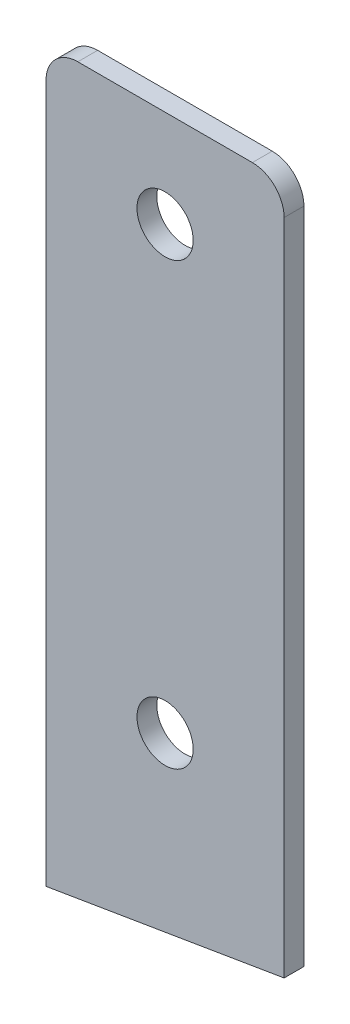
ISO-10303-21;
HEADER;
FILE_DESCRIPTION(('STEP AP214'),'2;1');
FILE_NAME('part.step','',(''),(''),'','','');
FILE_SCHEMA(('AUTOMOTIVE_DESIGN { 1 0 10303 214 1 1 1 1 }'));
ENDSEC;
DATA;
#1=APPLICATION_CONTEXT('core data for automotive mechanical design processes');
#2=APPLICATION_PROTOCOL_DEFINITION('international standard','automotive_design',2000,#1);
#3=PRODUCT_CONTEXT('',#1,'mechanical');
#4=PRODUCT('Part','Part','',(#3));
#5=PRODUCT_RELATED_PRODUCT_CATEGORY('part','',(#4));
#6=PRODUCT_DEFINITION_FORMATION('','',#4);
#7=PRODUCT_DEFINITION_CONTEXT('part definition',#1,'design');
#8=PRODUCT_DEFINITION('design','',#6,#7);
#9=PRODUCT_DEFINITION_SHAPE('','',#8);
#10=(LENGTH_UNIT() NAMED_UNIT(*) SI_UNIT(.MILLI.,.METRE.));
#11=(NAMED_UNIT(*) PLANE_ANGLE_UNIT() SI_UNIT($,.RADIAN.));
#12=(NAMED_UNIT(*) SI_UNIT($,.STERADIAN.) SOLID_ANGLE_UNIT());
#13=UNCERTAINTY_MEASURE_WITH_UNIT(LENGTH_MEASURE(1.E-05),#10,'distance_accuracy_value','');
#14=(GEOMETRIC_REPRESENTATION_CONTEXT(3) GLOBAL_UNCERTAINTY_ASSIGNED_CONTEXT((#13)) GLOBAL_UNIT_ASSIGNED_CONTEXT((#10,
#11,#12)) REPRESENTATION_CONTEXT('',''));
#15=CARTESIAN_POINT('',(0.,0.,0.));
#16=DIRECTION('',(0.,0.,1.));
#17=DIRECTION('',(1.,0.,0.));
#18=AXIS2_PLACEMENT_3D('',#15,#16,#17);
#19=CARTESIAN_POINT('',(9.525,0.,1.5875));
#20=DIRECTION('',(1.,0.,0.));
#21=DIRECTION('',(0.,1.,0.));
#22=AXIS2_PLACEMENT_3D('',#19,#20,#21);
#23=PLANE('',#22);
#24=DIRECTION('',(0.,-1.,0.));
#25=VECTOR('',#24,1.);
#26=CARTESIAN_POINT('',(9.525,0.,1.5875));
#27=LINE('',#26,#25);
#28=CARTESIAN_POINT('',(9.525,22.86,1.5875));
#29=VERTEX_POINT('',#28);
#30=CARTESIAN_POINT('',(9.52500000000001,-29.845,1.5875));
#31=VERTEX_POINT('',#30);
#32=EDGE_CURVE('E118',#29,#31,#27,.T.);
#33=ORIENTED_EDGE('',*,*,#32,.T.);
#34=DIRECTION('',(0.,0.,1.));
#35=VECTOR('',#34,1.);
#36=CARTESIAN_POINT('',(9.52500000000001,-29.845,0.));
#37=LINE('',#36,#35);
#38=CARTESIAN_POINT('',(9.52500000000001,-29.845,0.));
#39=VERTEX_POINT('',#38);
#40=EDGE_CURVE('E112',#39,#31,#37,.T.);
#41=ORIENTED_EDGE('',*,*,#40,.F.);
#42=DIRECTION('',(0.,-1.,0.));
#43=VECTOR('',#42,1.);
#44=CARTESIAN_POINT('',(9.525,0.,0.));
#45=LINE('',#44,#43);
#46=CARTESIAN_POINT('',(9.525,22.86,0.));
#47=VERTEX_POINT('',#46);
#48=EDGE_CURVE('E111',#47,#39,#45,.T.);
#49=ORIENTED_EDGE('',*,*,#48,.F.);
#50=DIRECTION('',(0.,0.,-1.));
#51=VECTOR('',#50,1.);
#52=CARTESIAN_POINT('',(9.525,22.86,1.5875));
#53=LINE('',#52,#51);
#54=EDGE_CURVE('E12',#47,#29,#53,.F.);
#55=ORIENTED_EDGE('',*,*,#54,.T.);
#56=EDGE_LOOP('',(#33,#41,#49,#55));
#57=FACE_BOUND('',#56,.T.);
#58=ADVANCED_FACE('F39',(#57),#23,.T.);
#59=CARTESIAN_POINT('',(0.,0.,1.5875));
#60=DIRECTION('',(0.,0.,1.));
#61=DIRECTION('',(1.,0.,0.));
#62=AXIS2_PLACEMENT_3D('',#59,#60,#61);
#63=PLANE('',#62);
#64=CARTESIAN_POINT('',(0.,17.6276,1.5875));
#65=DIRECTION('',(0.,0.,1.));
#66=DIRECTION('',(1.,0.,0.));
#67=AXIS2_PLACEMENT_3D('',#64,#65,#66);
#68=CIRCLE('',#67,2.24999999999999);
#69=CARTESIAN_POINT('',(2.24999999999999,17.6276,1.5875));
#70=VERTEX_POINT('',#69);
#71=EDGE_CURVE('E105',#70,#70,#68,.T.);
#72=ORIENTED_EDGE('',*,*,#71,.F.);
#73=EDGE_LOOP('',(#72));
#74=FACE_BOUND('',#73,.T.);
#75=CARTESIAN_POINT('',(0.,-17.6276,1.5875));
#76=DIRECTION('',(0.,0.,1.));
#77=DIRECTION('',(1.,0.,0.));
#78=AXIS2_PLACEMENT_3D('',#75,#76,#77);
#79=CIRCLE('',#78,2.24999999999999);
#80=CARTESIAN_POINT('',(2.24999999999999,-17.6276,1.5875));
#81=VERTEX_POINT('',#80);
#82=EDGE_CURVE('E149',#81,#81,#79,.T.);
#83=ORIENTED_EDGE('',*,*,#82,.F.);
#84=EDGE_LOOP('',(#83));
#85=FACE_BOUND('',#84,.T.);
#86=DIRECTION('',(0.,-1.,0.));
#87=VECTOR('',#86,1.);
#88=CARTESIAN_POINT('',(-9.525,0.,1.5875));
#89=LINE('',#88,#87);
#90=CARTESIAN_POINT('',(-9.525,22.86,1.5875));
#91=VERTEX_POINT('',#90);
#92=CARTESIAN_POINT('',(-9.525,-33.02,1.5875));
#93=VERTEX_POINT('',#92);
#94=EDGE_CURVE('E129',#91,#93,#89,.T.);
#95=ORIENTED_EDGE('',*,*,#94,.T.);
#96=DIRECTION('',(0.986393923832144,0.164398987305357,0.));
#97=VECTOR('',#96,1.);
#98=CARTESIAN_POINT('',(5.09716216216216,-30.582972972973,1.5875));
#99=LINE('',#98,#97);
#100=EDGE_CURVE('E100',#93,#31,#99,.T.);
#101=ORIENTED_EDGE('',*,*,#100,.T.);
#102=ORIENTED_EDGE('',*,*,#32,.F.);
#103=CARTESIAN_POINT('',(6.985,22.86,1.5875));
#104=DIRECTION('',(0.,0.,1.));
#105=DIRECTION('',(1.,0.,0.));
#106=AXIS2_PLACEMENT_3D('',#103,#104,#105);
#107=CIRCLE('',#106,2.54);
#108=CARTESIAN_POINT('',(6.985,25.4,1.5875));
#109=VERTEX_POINT('',#108);
#110=EDGE_CURVE('E61',#29,#109,#107,.T.);
#111=ORIENTED_EDGE('',*,*,#110,.T.);
#112=DIRECTION('',(1.,0.,0.));
#113=VECTOR('',#112,1.);
#114=CARTESIAN_POINT('',(0.,25.4,1.5875));
#115=LINE('',#114,#113);
#116=CARTESIAN_POINT('',(-6.985,25.4,1.5875));
#117=VERTEX_POINT('',#116);
#118=EDGE_CURVE('E121',#117,#109,#115,.T.);
#119=ORIENTED_EDGE('',*,*,#118,.F.);
#120=CARTESIAN_POINT('',(-6.985,22.86,1.5875));
#121=DIRECTION('',(0.,0.,1.));
#122=DIRECTION('',(1.,0.,0.));
#123=AXIS2_PLACEMENT_3D('',#120,#121,#122);
#124=CIRCLE('',#123,2.54);
#125=EDGE_CURVE('E48',#117,#91,#124,.T.);
#126=ORIENTED_EDGE('',*,*,#125,.T.);
#127=EDGE_LOOP('',(#95,#101,#102,#111,#119,#126));
#128=FACE_BOUND('',#127,.T.);
#129=ADVANCED_FACE('F166',(#74,#85,#128),#63,.T.);
#130=CARTESIAN_POINT('',(0.,0.,0.));
#131=DIRECTION('',(0.,0.,1.));
#132=DIRECTION('',(1.,0.,0.));
#133=AXIS2_PLACEMENT_3D('',#130,#131,#132);
#134=PLANE('',#133);
#135=CARTESIAN_POINT('',(0.,-17.6276,0.));
#136=DIRECTION('',(0.,0.,1.));
#137=DIRECTION('',(1.,0.,0.));
#138=AXIS2_PLACEMENT_3D('',#135,#136,#137);
#139=CIRCLE('',#138,2.25);
#140=CARTESIAN_POINT('',(2.25,-17.6276,0.));
#141=VERTEX_POINT('',#140);
#142=EDGE_CURVE('E147',#141,#141,#139,.T.);
#143=ORIENTED_EDGE('',*,*,#142,.T.);
#144=EDGE_LOOP('',(#143));
#145=FACE_BOUND('',#144,.T.);
#146=CARTESIAN_POINT('',(0.,17.6276,0.));
#147=DIRECTION('',(0.,0.,1.));
#148=DIRECTION('',(1.,0.,0.));
#149=AXIS2_PLACEMENT_3D('',#146,#147,#148);
#150=CIRCLE('',#149,2.25);
#151=CARTESIAN_POINT('',(2.25,17.6276,0.));
#152=VERTEX_POINT('',#151);
#153=EDGE_CURVE('E153',#152,#152,#150,.T.);
#154=ORIENTED_EDGE('',*,*,#153,.T.);
#155=EDGE_LOOP('',(#154));
#156=FACE_BOUND('',#155,.T.);
#157=DIRECTION('',(0.986393923832144,0.164398987305357,0.));
#158=VECTOR('',#157,1.);
#159=CARTESIAN_POINT('',(5.09716216216216,-30.582972972973,0.));
#160=LINE('',#159,#158);
#161=CARTESIAN_POINT('',(-9.525,-33.02,0.));
#162=VERTEX_POINT('',#161);
#163=EDGE_CURVE('E97',#162,#39,#160,.T.);
#164=ORIENTED_EDGE('',*,*,#163,.F.);
#165=DIRECTION('',(0.,-1.,0.));
#166=VECTOR('',#165,1.);
#167=CARTESIAN_POINT('',(-9.525,0.,0.));
#168=LINE('',#167,#166);
#169=CARTESIAN_POINT('',(-9.525,22.86,0.));
#170=VERTEX_POINT('',#169);
#171=EDGE_CURVE('E110',#170,#162,#168,.T.);
#172=ORIENTED_EDGE('',*,*,#171,.F.);
#173=CARTESIAN_POINT('',(-6.985,22.86,0.));
#174=DIRECTION('',(0.,0.,1.));
#175=DIRECTION('',(1.,0.,0.));
#176=AXIS2_PLACEMENT_3D('',#173,#174,#175);
#177=CIRCLE('',#176,2.54);
#178=CARTESIAN_POINT('',(-6.985,25.4,0.));
#179=VERTEX_POINT('',#178);
#180=EDGE_CURVE('E131',#170,#179,#177,.F.);
#181=ORIENTED_EDGE('',*,*,#180,.T.);
#182=DIRECTION('',(1.,0.,0.));
#183=VECTOR('',#182,1.);
#184=CARTESIAN_POINT('',(0.,25.4,0.));
#185=LINE('',#184,#183);
#186=CARTESIAN_POINT('',(6.985,25.4,0.));
#187=VERTEX_POINT('',#186);
#188=EDGE_CURVE('E119',#179,#187,#185,.T.);
#189=ORIENTED_EDGE('',*,*,#188,.T.);
#190=CARTESIAN_POINT('',(6.985,22.86,0.));
#191=DIRECTION('',(0.,0.,1.));
#192=DIRECTION('',(1.,0.,0.));
#193=AXIS2_PLACEMENT_3D('',#190,#191,#192);
#194=CIRCLE('',#193,2.54);
#195=EDGE_CURVE('E128',#187,#47,#194,.F.);
#196=ORIENTED_EDGE('',*,*,#195,.T.);
#197=ORIENTED_EDGE('',*,*,#48,.T.);
#198=EDGE_LOOP('',(#164,#172,#181,#189,#196,#197));
#199=FACE_BOUND('',#198,.T.);
#200=ADVANCED_FACE('F109',(#145,#156,#199),#134,.F.);
#201=CARTESIAN_POINT('',(0.,25.4,1.5875));
#202=DIRECTION('',(0.,1.,0.));
#203=DIRECTION('',(-1.,0.,0.));
#204=AXIS2_PLACEMENT_3D('',#201,#202,#203);
#205=PLANE('',#204);
#206=ORIENTED_EDGE('',*,*,#188,.F.);
#207=DIRECTION('',(0.,0.,-1.));
#208=VECTOR('',#207,1.);
#209=CARTESIAN_POINT('',(-6.985,25.4,1.5875));
#210=LINE('',#209,#208);
#211=EDGE_CURVE('E136',#179,#117,#210,.F.);
#212=ORIENTED_EDGE('',*,*,#211,.T.);
#213=ORIENTED_EDGE('',*,*,#118,.T.);
#214=DIRECTION('',(0.,0.,-1.));
#215=VECTOR('',#214,1.);
#216=CARTESIAN_POINT('',(6.985,25.4,1.5875));
#217=LINE('',#216,#215);
#218=EDGE_CURVE('E133',#109,#187,#217,.T.);
#219=ORIENTED_EDGE('',*,*,#218,.T.);
#220=EDGE_LOOP('',(#206,#212,#213,#219));
#221=FACE_BOUND('',#220,.T.);
#222=ADVANCED_FACE('F173',(#221),#205,.T.);
#223=CARTESIAN_POINT('',(-9.525,0.,1.5875));
#224=DIRECTION('',(1.,0.,0.));
#225=DIRECTION('',(0.,1.,0.));
#226=AXIS2_PLACEMENT_3D('',#223,#224,#225);
#227=PLANE('',#226);
#228=ORIENTED_EDGE('',*,*,#94,.F.);
#229=DIRECTION('',(0.,0.,-1.));
#230=VECTOR('',#229,1.);
#231=CARTESIAN_POINT('',(-9.525,22.86,0.));
#232=LINE('',#231,#230);
#233=EDGE_CURVE('E117',#91,#170,#232,.T.);
#234=ORIENTED_EDGE('',*,*,#233,.T.);
#235=ORIENTED_EDGE('',*,*,#171,.T.);
#236=DIRECTION('',(0.,0.,1.));
#237=VECTOR('',#236,1.);
#238=CARTESIAN_POINT('',(-9.525,-33.02,0.));
#239=LINE('',#238,#237);
#240=EDGE_CURVE('E94',#162,#93,#239,.T.);
#241=ORIENTED_EDGE('',*,*,#240,.T.);
#242=EDGE_LOOP('',(#228,#234,#235,#241));
#243=FACE_BOUND('',#242,.T.);
#244=ADVANCED_FACE('F115',(#243),#227,.F.);
#245=CARTESIAN_POINT('',(0.,-17.6276,1.5875));
#246=DIRECTION('',(0.,0.,1.));
#247=DIRECTION('',(1.,0.,0.));
#248=AXIS2_PLACEMENT_3D('',#245,#246,#247);
#249=CYLINDRICAL_SURFACE('',#248,2.24999999999999);
#250=ORIENTED_EDGE('',*,*,#142,.F.);
#251=EDGE_LOOP('',(#250));
#252=FACE_BOUND('',#251,.T.);
#253=ORIENTED_EDGE('',*,*,#82,.T.);
#254=EDGE_LOOP('',(#253));
#255=FACE_BOUND('',#254,.T.);
#256=ADVANCED_FACE('F190',(#252,#255),#249,.F.);
#257=CARTESIAN_POINT('',(0.,17.6276,1.5875));
#258=DIRECTION('',(0.,0.,1.));
#259=DIRECTION('',(1.,0.,0.));
#260=AXIS2_PLACEMENT_3D('',#257,#258,#259);
#261=CYLINDRICAL_SURFACE('',#260,2.24999999999999);
#262=ORIENTED_EDGE('',*,*,#153,.F.);
#263=EDGE_LOOP('',(#262));
#264=FACE_BOUND('',#263,.T.);
#265=ORIENTED_EDGE('',*,*,#71,.T.);
#266=EDGE_LOOP('',(#265));
#267=FACE_BOUND('',#266,.T.);
#268=ADVANCED_FACE('F188',(#264,#267),#261,.F.);
#269=CARTESIAN_POINT('',(-6.985,22.86,1.5875));
#270=DIRECTION('',(0.,0.,1.));
#271=DIRECTION('',(1.,0.,0.));
#272=AXIS2_PLACEMENT_3D('',#269,#270,#271);
#273=CYLINDRICAL_SURFACE('',#272,2.54);
#274=ORIENTED_EDGE('',*,*,#125,.F.);
#275=ORIENTED_EDGE('',*,*,#211,.F.);
#276=ORIENTED_EDGE('',*,*,#180,.F.);
#277=ORIENTED_EDGE('',*,*,#233,.F.);
#278=EDGE_LOOP('',(#274,#275,#276,#277));
#279=FACE_BOUND('',#278,.T.);
#280=ADVANCED_FACE('F169',(#279),#273,.T.);
#281=CARTESIAN_POINT('',(6.985,22.86,1.5875));
#282=DIRECTION('',(0.,0.,-1.));
#283=DIRECTION('',(-1.,0.,0.));
#284=AXIS2_PLACEMENT_3D('',#281,#282,#283);
#285=CYLINDRICAL_SURFACE('',#284,2.54);
#286=ORIENTED_EDGE('',*,*,#110,.F.);
#287=ORIENTED_EDGE('',*,*,#54,.F.);
#288=ORIENTED_EDGE('',*,*,#195,.F.);
#289=ORIENTED_EDGE('',*,*,#218,.F.);
#290=EDGE_LOOP('',(#286,#287,#288,#289));
#291=FACE_BOUND('',#290,.T.);
#292=ADVANCED_FACE('F41',(#291),#285,.T.);
#293=CARTESIAN_POINT('',(5.09716216216216,-30.582972972973,0.));
#294=DIRECTION('',(0.164398987305357,-0.986393923832144,0.));
#295=DIRECTION('',(0.986393923832144,0.164398987305357,0.));
#296=AXIS2_PLACEMENT_3D('',#293,#294,#295);
#297=PLANE('',#296);
#298=ORIENTED_EDGE('',*,*,#240,.F.);
#299=ORIENTED_EDGE('',*,*,#163,.T.);
#300=ORIENTED_EDGE('',*,*,#40,.T.);
#301=ORIENTED_EDGE('',*,*,#100,.F.);
#302=EDGE_LOOP('',(#298,#299,#300,#301));
#303=FACE_BOUND('',#302,.T.);
#304=ADVANCED_FACE('F96',(#303),#297,.T.);
#305=CLOSED_SHELL('',(#58,#129,#200,#222,#244,#256,#268,#280,#292,#304));
#306=MANIFOLD_SOLID_BREP('B2',#305);
#307=ADVANCED_BREP_SHAPE_REPRESENTATION('',(#18,#306),#14);
#308=SHAPE_DEFINITION_REPRESENTATION(#9,#307);
ENDSEC;
END-ISO-10303-21;
